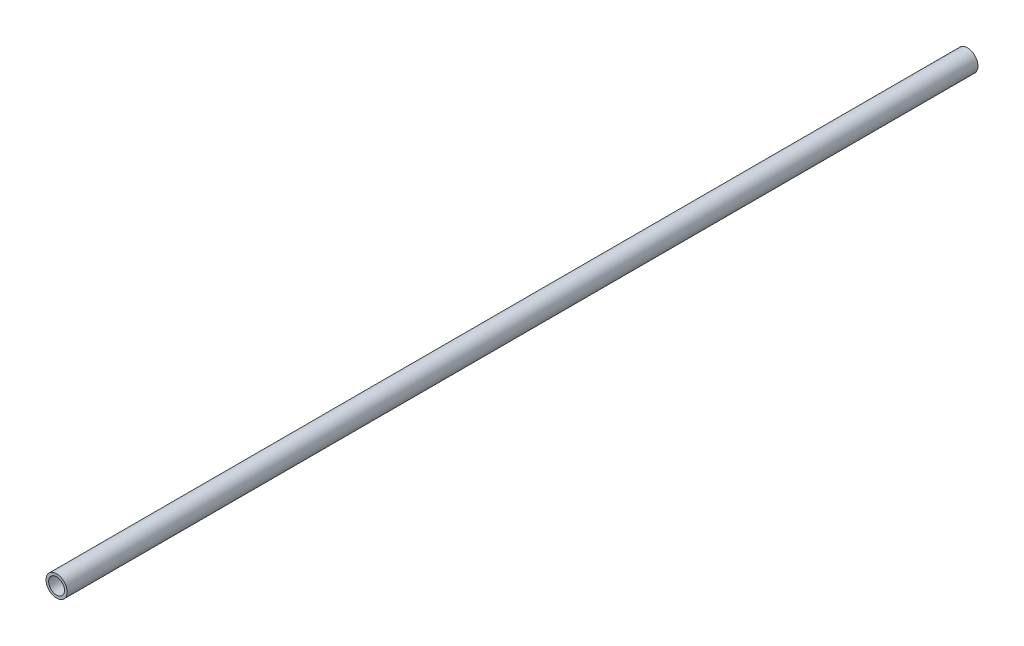
ISO-10303-21;
HEADER;
FILE_DESCRIPTION(('STEP AP214'),'2;1');
FILE_NAME('part.step','',(''),(''),'','','');
FILE_SCHEMA(('AUTOMOTIVE_DESIGN { 1 0 10303 214 1 1 1 1 }'));
ENDSEC;
DATA;
#1=APPLICATION_CONTEXT('core data for automotive mechanical design processes');
#2=APPLICATION_PROTOCOL_DEFINITION('international standard','automotive_design',2000,#1);
#3=PRODUCT_CONTEXT('',#1,'mechanical');
#4=PRODUCT('Part','Part','',(#3));
#5=PRODUCT_RELATED_PRODUCT_CATEGORY('part','',(#4));
#6=PRODUCT_DEFINITION_FORMATION('','',#4);
#7=PRODUCT_DEFINITION_CONTEXT('part definition',#1,'design');
#8=PRODUCT_DEFINITION('design','',#6,#7);
#9=PRODUCT_DEFINITION_SHAPE('','',#8);
#10=(LENGTH_UNIT() NAMED_UNIT(*) SI_UNIT(.MILLI.,.METRE.));
#11=(NAMED_UNIT(*) PLANE_ANGLE_UNIT() SI_UNIT($,.RADIAN.));
#12=(NAMED_UNIT(*) SI_UNIT($,.STERADIAN.) SOLID_ANGLE_UNIT());
#13=UNCERTAINTY_MEASURE_WITH_UNIT(LENGTH_MEASURE(1.E-05),#10,'distance_accuracy_value','');
#14=(GEOMETRIC_REPRESENTATION_CONTEXT(3) GLOBAL_UNCERTAINTY_ASSIGNED_CONTEXT((#13)) GLOBAL_UNIT_ASSIGNED_CONTEXT((#10,
#11,#12)) REPRESENTATION_CONTEXT('',''));
#15=CARTESIAN_POINT('',(0.,0.,0.));
#16=DIRECTION('',(0.,0.,1.));
#17=DIRECTION('',(1.,0.,0.));
#18=AXIS2_PLACEMENT_3D('',#15,#16,#17);
#19=CARTESIAN_POINT('',(0.,0.,172.));
#20=DIRECTION('',(0.,0.,1.));
#21=DIRECTION('',(1.,0.,0.));
#22=AXIS2_PLACEMENT_3D('',#19,#20,#21);
#23=PLANE('',#22);
#24=CARTESIAN_POINT('',(0.,0.,172.));
#25=DIRECTION('',(0.,0.,1.));
#26=DIRECTION('',(1.,0.,0.));
#27=AXIS2_PLACEMENT_3D('',#24,#25,#26);
#28=CIRCLE('',#27,2.);
#29=CARTESIAN_POINT('',(2.,0.,172.));
#30=VERTEX_POINT('',#29);
#31=EDGE_CURVE('E10',#30,#30,#28,.T.);
#32=ORIENTED_EDGE('',*,*,#31,.T.);
#33=EDGE_LOOP('',(#32));
#34=FACE_BOUND('',#33,.T.);
#35=CARTESIAN_POINT('',(0.,0.,172.));
#36=DIRECTION('',(0.,0.,1.));
#37=DIRECTION('',(1.,0.,0.));
#38=AXIS2_PLACEMENT_3D('',#35,#36,#37);
#39=CIRCLE('',#38,1.5);
#40=CARTESIAN_POINT('',(1.5,0.,172.));
#41=VERTEX_POINT('',#40);
#42=EDGE_CURVE('E42',#41,#41,#39,.T.);
#43=ORIENTED_EDGE('',*,*,#42,.F.);
#44=EDGE_LOOP('',(#43));
#45=FACE_BOUND('',#44,.T.);
#46=ADVANCED_FACE('F31',(#34,#45),#23,.T.);
#47=CARTESIAN_POINT('',(0.,0.,0.));
#48=DIRECTION('',(0.,0.,1.));
#49=DIRECTION('',(1.,0.,0.));
#50=AXIS2_PLACEMENT_3D('',#47,#48,#49);
#51=PLANE('',#50);
#52=CARTESIAN_POINT('',(0.,0.,0.));
#53=DIRECTION('',(0.,0.,1.));
#54=DIRECTION('',(1.,0.,0.));
#55=AXIS2_PLACEMENT_3D('',#52,#53,#54);
#56=CIRCLE('',#55,2.);
#57=CARTESIAN_POINT('',(2.,0.,0.));
#58=VERTEX_POINT('',#57);
#59=EDGE_CURVE('E35',#58,#58,#56,.T.);
#60=ORIENTED_EDGE('',*,*,#59,.F.);
#61=EDGE_LOOP('',(#60));
#62=FACE_BOUND('',#61,.T.);
#63=CARTESIAN_POINT('',(0.,0.,0.));
#64=DIRECTION('',(0.,0.,1.));
#65=DIRECTION('',(1.,0.,0.));
#66=AXIS2_PLACEMENT_3D('',#63,#64,#65);
#67=CIRCLE('',#66,1.5);
#68=CARTESIAN_POINT('',(1.5,0.,0.));
#69=VERTEX_POINT('',#68);
#70=EDGE_CURVE('E44',#69,#69,#67,.T.);
#71=ORIENTED_EDGE('',*,*,#70,.T.);
#72=EDGE_LOOP('',(#71));
#73=FACE_BOUND('',#72,.T.);
#74=ADVANCED_FACE('F54',(#62,#73),#51,.F.);
#75=CARTESIAN_POINT('',(0.,0.,172.));
#76=DIRECTION('',(0.,0.,-1.));
#77=DIRECTION('',(-1.,0.,0.));
#78=AXIS2_PLACEMENT_3D('',#75,#76,#77);
#79=CYLINDRICAL_SURFACE('',#78,2.);
#80=ORIENTED_EDGE('',*,*,#31,.F.);
#81=EDGE_LOOP('',(#80));
#82=FACE_BOUND('',#81,.T.);
#83=ORIENTED_EDGE('',*,*,#59,.T.);
#84=EDGE_LOOP('',(#83));
#85=FACE_BOUND('',#84,.T.);
#86=ADVANCED_FACE('F33',(#82,#85),#79,.T.);
#87=CARTESIAN_POINT('',(0.,0.,172.));
#88=DIRECTION('',(0.,0.,-1.));
#89=DIRECTION('',(-1.,0.,0.));
#90=AXIS2_PLACEMENT_3D('',#87,#88,#89);
#91=CYLINDRICAL_SURFACE('',#90,1.5);
#92=ORIENTED_EDGE('',*,*,#42,.T.);
#93=EDGE_LOOP('',(#92));
#94=FACE_BOUND('',#93,.T.);
#95=ORIENTED_EDGE('',*,*,#70,.F.);
#96=EDGE_LOOP('',(#95));
#97=FACE_BOUND('',#96,.T.);
#98=ADVANCED_FACE('F50',(#94,#97),#91,.F.);
#99=CLOSED_SHELL('',(#46,#74,#86,#98));
#100=MANIFOLD_SOLID_BREP('B2',#99);
#101=ADVANCED_BREP_SHAPE_REPRESENTATION('',(#18,#100),#14);
#102=SHAPE_DEFINITION_REPRESENTATION(#9,#101);
ENDSEC;
END-ISO-10303-21;
